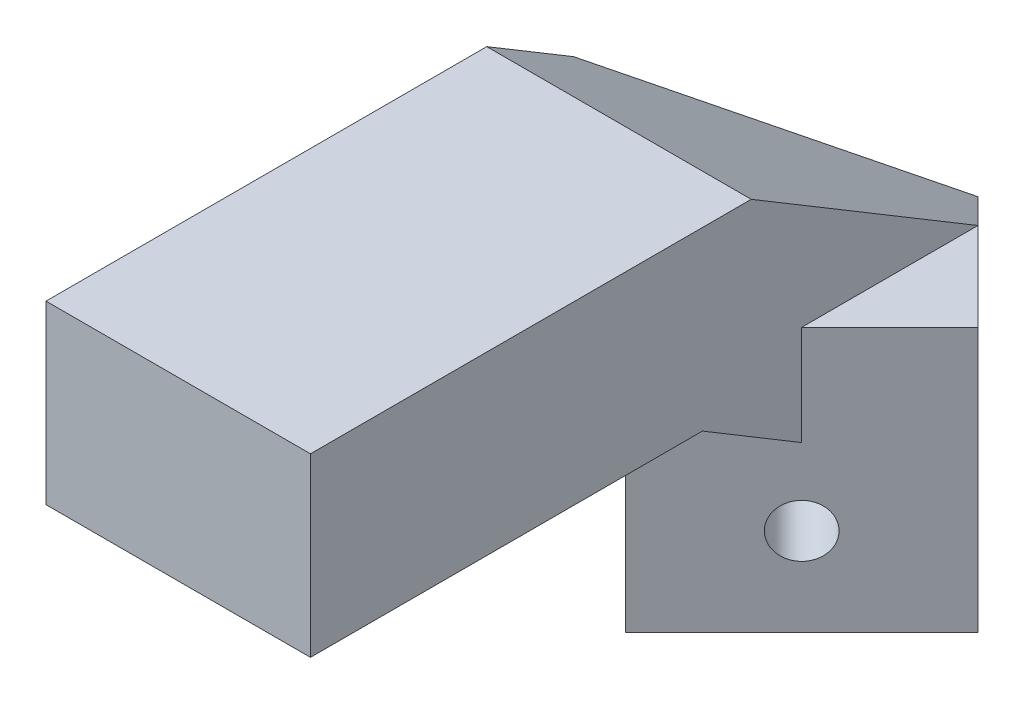
ISO-10303-21;
HEADER;
FILE_DESCRIPTION(('STEP AP214'),'2;1');
FILE_NAME('part.step','',(''),(''),'','','');
FILE_SCHEMA(('AUTOMOTIVE_DESIGN { 1 0 10303 214 1 1 1 1 }'));
ENDSEC;
DATA;
#1=APPLICATION_CONTEXT('core data for automotive mechanical design processes');
#2=APPLICATION_PROTOCOL_DEFINITION('international standard','automotive_design',2000,#1);
#3=PRODUCT_CONTEXT('',#1,'mechanical');
#4=PRODUCT('Part','Part','',(#3));
#5=PRODUCT_RELATED_PRODUCT_CATEGORY('part','',(#4));
#6=PRODUCT_DEFINITION_FORMATION('','',#4);
#7=PRODUCT_DEFINITION_CONTEXT('part definition',#1,'design');
#8=PRODUCT_DEFINITION('design','',#6,#7);
#9=PRODUCT_DEFINITION_SHAPE('','',#8);
#10=(LENGTH_UNIT() NAMED_UNIT(*) SI_UNIT(.MILLI.,.METRE.));
#11=(NAMED_UNIT(*) PLANE_ANGLE_UNIT() SI_UNIT($,.RADIAN.));
#12=(NAMED_UNIT(*) SI_UNIT($,.STERADIAN.) SOLID_ANGLE_UNIT());
#13=UNCERTAINTY_MEASURE_WITH_UNIT(LENGTH_MEASURE(1.E-05),#10,'distance_accuracy_value','');
#14=(GEOMETRIC_REPRESENTATION_CONTEXT(3) GLOBAL_UNCERTAINTY_ASSIGNED_CONTEXT((#13)) GLOBAL_UNIT_ASSIGNED_CONTEXT((#10,
#11,#12)) REPRESENTATION_CONTEXT('',''));
#15=CARTESIAN_POINT('',(0.,0.,0.));
#16=DIRECTION('',(0.,0.,1.));
#17=DIRECTION('',(1.,0.,0.));
#18=AXIS2_PLACEMENT_3D('',#15,#16,#17);
#19=CARTESIAN_POINT('',(30.,-20.,-10.));
#20=DIRECTION('',(0.,0.,-1.));
#21=DIRECTION('',(1.,0.,0.));
#22=AXIS2_PLACEMENT_3D('',#19,#20,#21);
#23=PLANE('',#22);
#24=DIRECTION('',(0.,1.,0.));
#25=VECTOR('',#24,1.);
#26=CARTESIAN_POINT('',(0.,-20.,-10.));
#27=LINE('',#26,#25);
#28=CARTESIAN_POINT('',(0.,-20.,-10.));
#29=VERTEX_POINT('',#28);
#30=CARTESIAN_POINT('',(0.,0.,-10.));
#31=VERTEX_POINT('',#30);
#32=EDGE_CURVE('E182',#29,#31,#27,.T.);
#33=ORIENTED_EDGE('',*,*,#32,.F.);
#34=DIRECTION('',(-1.,0.,0.));
#35=VECTOR('',#34,1.);
#36=CARTESIAN_POINT('',(30.,-20.,-10.));
#37=LINE('',#36,#35);
#38=CARTESIAN_POINT('',(30.,-20.,-10.));
#39=VERTEX_POINT('',#38);
#40=EDGE_CURVE('E196',#39,#29,#37,.T.);
#41=ORIENTED_EDGE('',*,*,#40,.F.);
#42=DIRECTION('',(0.,1.,0.));
#43=VECTOR('',#42,1.);
#44=CARTESIAN_POINT('',(30.,-20.,-10.));
#45=LINE('',#44,#43);
#46=CARTESIAN_POINT('',(30.,0.,-10.));
#47=VERTEX_POINT('',#46);
#48=EDGE_CURVE('E183',#39,#47,#45,.T.);
#49=ORIENTED_EDGE('',*,*,#48,.T.);
#50=DIRECTION('',(-1.,0.,0.));
#51=VECTOR('',#50,1.);
#52=CARTESIAN_POINT('',(30.,0.,-10.));
#53=LINE('',#52,#51);
#54=EDGE_CURVE('E214',#47,#31,#53,.T.);
#55=ORIENTED_EDGE('',*,*,#54,.T.);
#56=EDGE_LOOP('',(#33,#41,#49,#55));
#57=FACE_BOUND('',#56,.T.);
#58=ADVANCED_FACE('F32',(#57),#23,.F.);
#59=CARTESIAN_POINT('',(30.,0.,-10.));
#60=DIRECTION('',(0.,-1.,0.));
#61=DIRECTION('',(0.,0.,1.));
#62=AXIS2_PLACEMENT_3D('',#59,#60,#61);
#63=PLANE('',#62);
#64=DIRECTION('',(0.,0.,-1.));
#65=VECTOR('',#64,1.);
#66=CARTESIAN_POINT('',(0.,0.,-10.));
#67=LINE('',#66,#65);
#68=CARTESIAN_POINT('',(0.,0.,-60.));
#69=VERTEX_POINT('',#68);
#70=EDGE_CURVE('E199',#31,#69,#67,.T.);
#71=ORIENTED_EDGE('',*,*,#70,.F.);
#72=ORIENTED_EDGE('',*,*,#54,.F.);
#73=DIRECTION('',(0.,0.,-1.));
#74=VECTOR('',#73,1.);
#75=CARTESIAN_POINT('',(30.,0.,-10.));
#76=LINE('',#75,#74);
#77=CARTESIAN_POINT('',(30.,0.,-60.));
#78=VERTEX_POINT('',#77);
#79=EDGE_CURVE('E186',#47,#78,#76,.T.);
#80=ORIENTED_EDGE('',*,*,#79,.T.);
#81=DIRECTION('',(-1.,0.,0.));
#82=VECTOR('',#81,1.);
#83=CARTESIAN_POINT('',(30.,0.,-60.));
#84=LINE('',#83,#82);
#85=EDGE_CURVE('E211',#78,#69,#84,.T.);
#86=ORIENTED_EDGE('',*,*,#85,.T.);
#87=EDGE_LOOP('',(#71,#72,#80,#86));
#88=FACE_BOUND('',#87,.T.);
#89=ADVANCED_FACE('F231',(#88),#63,.F.);
#90=CARTESIAN_POINT('',(30.,0.,-60.));
#91=DIRECTION('',(0.,-0.857492925712545,0.514495755427526));
#92=DIRECTION('',(0.,0.514495755427526,0.857492925712545));
#93=AXIS2_PLACEMENT_3D('',#90,#91,#92);
#94=PLANE('',#93);
#95=ORIENTED_EDGE('',*,*,#85,.F.);
#96=DIRECTION('',(0.,-0.514495755427526,-0.857492925712544));
#97=VECTOR('',#96,1.);
#98=CARTESIAN_POINT('',(30.,0.,-60.));
#99=LINE('',#98,#97);
#100=CARTESIAN_POINT('',(30.,-15.4348726628258,-85.7247877713763));
#101=VERTEX_POINT('',#100);
#102=EDGE_CURVE('E133',#78,#101,#99,.T.);
#103=ORIENTED_EDGE('',*,*,#102,.T.);
#104=DIRECTION('',(0.650944554904121,0.390566732942471,0.650944554904118));
#105=VECTOR('',#104,1.);
#106=CARTESIAN_POINT('',(30.8474576271187,-14.9263980865546,-84.8773301442577));
#107=LINE('',#106,#105);
#108=CARTESIAN_POINT('',(22.9289321881345,-19.6775133499451,-92.7958555832418));
#109=VERTEX_POINT('',#108);
#110=EDGE_CURVE('E118',#109,#101,#107,.T.);
#111=ORIENTED_EDGE('',*,*,#110,.F.);
#112=DIRECTION('',(0.650944554904118,-0.390566732942472,-0.650944554904121));
#113=VECTOR('',#112,1.);
#114=CARTESIAN_POINT('',(-26.8724643293838,10.203324560566,-42.9944590657233));
#115=LINE('',#114,#113);
#116=CARTESIAN_POINT('',(0.,-5.92015403706431,-69.8669233951072));
#117=VERTEX_POINT('',#116);
#118=EDGE_CURVE('E11',#117,#109,#115,.T.);
#119=ORIENTED_EDGE('',*,*,#118,.F.);
#120=DIRECTION('',(0.,0.514495755427526,0.857492925712544));
#121=VECTOR('',#120,1.);
#122=CARTESIAN_POINT('',(0.,22.0588235294118,-23.235294117647));
#123=LINE('',#122,#121);
#124=EDGE_CURVE('E134',#117,#69,#123,.T.);
#125=ORIENTED_EDGE('',*,*,#124,.T.);
#126=EDGE_LOOP('',(#95,#103,#111,#119,#125));
#127=FACE_BOUND('',#126,.T.);
#128=ADVANCED_FACE('F132',(#127),#94,.F.);
#129=CARTESIAN_POINT('',(30.,-45.4348726628258,-85.7247877713763));
#130=DIRECTION('',(0.,1.,0.));
#131=DIRECTION('',(0.,0.,-1.));
#132=AXIS2_PLACEMENT_3D('',#129,#130,#131);
#133=PLANE('',#132);
#134=DIRECTION('',(-0.707106781186549,0.,-0.707106781186546));
#135=VECTOR('',#134,1.);
#136=CARTESIAN_POINT('',(40.,-45.4348726628258,-75.7247877713764));
#137=LINE('',#136,#135);
#138=CARTESIAN_POINT('',(40.,-45.4348726628258,-75.7247877713764));
#139=VERTEX_POINT('',#138);
#140=CARTESIAN_POINT('',(22.9289321881345,-45.4348726628258,-92.7958555832418));
#141=VERTEX_POINT('',#140);
#142=EDGE_CURVE('E121',#139,#141,#137,.T.);
#143=ORIENTED_EDGE('',*,*,#142,.F.);
#144=DIRECTION('',(0.707106781186546,0.,-0.707106781186549));
#145=VECTOR('',#144,1.);
#146=CARTESIAN_POINT('',(20.0000000000001,-45.4348726628258,-55.7247877713764));
#147=LINE('',#146,#145);
#148=CARTESIAN_POINT('',(20.0000000000001,-45.4348726628258,-55.7247877713764));
#149=VERTEX_POINT('',#148);
#150=EDGE_CURVE('E153',#149,#139,#147,.T.);
#151=ORIENTED_EDGE('',*,*,#150,.F.);
#152=DIRECTION('',(-0.707106781186549,0.,-0.707106781186546));
#153=VECTOR('',#152,1.);
#154=CARTESIAN_POINT('',(20.0000000000001,-45.4348726628258,-55.7247877713764));
#155=LINE('',#154,#153);
#156=CARTESIAN_POINT('',(2.9289321881346,-45.4348726628258,-72.7958555832418));
#157=VERTEX_POINT('',#156);
#158=EDGE_CURVE('E161',#149,#157,#155,.T.);
#159=ORIENTED_EDGE('',*,*,#158,.T.);
#160=DIRECTION('',(0.707106781186546,0.,-0.707106781186549));
#161=VECTOR('',#160,1.);
#162=CARTESIAN_POINT('',(2.9289321881346,-45.4348726628258,-72.7958555832418));
#163=LINE('',#162,#161);
#164=EDGE_CURVE('E125',#157,#141,#163,.T.);
#165=ORIENTED_EDGE('',*,*,#164,.T.);
#166=EDGE_LOOP('',(#143,#151,#159,#165));
#167=FACE_BOUND('',#166,.T.);
#168=ADVANCED_FACE('F249',(#167),#133,.F.);
#169=CARTESIAN_POINT('',(30.,-20.,-54.4603207010313));
#170=DIRECTION('',(0.,0.857492925712544,-0.514495755427526));
#171=DIRECTION('',(0.,-0.514495755427526,-0.857492925712545));
#172=AXIS2_PLACEMENT_3D('',#169,#170,#171);
#173=PLANE('',#172);
#174=DIRECTION('',(-0.650944554904118,0.390566732942472,0.650944554904121));
#175=VECTOR('',#174,1.);
#176=CARTESIAN_POINT('',(23.5086121967503,-22.8638475602572,-59.2333999681267));
#177=LINE('',#176,#175);
#178=CARTESIAN_POINT('',(30.,-26.758680242207,-65.7247877713763));
#179=VERTEX_POINT('',#178);
#180=CARTESIAN_POINT('',(20.0000000000001,-20.758680242207,-55.7247877713764));
#181=VERTEX_POINT('',#180);
#182=EDGE_CURVE('E170',#179,#181,#177,.T.);
#183=ORIENTED_EDGE('',*,*,#182,.F.);
#184=DIRECTION('',(0.,0.514495755427526,0.857492925712544));
#185=VECTOR('',#184,1.);
#186=CARTESIAN_POINT('',(30.,-20.,-54.4603207010313));
#187=LINE('',#186,#185);
#188=CARTESIAN_POINT('',(30.,-20.,-54.4603207010313));
#189=VERTEX_POINT('',#188);
#190=EDGE_CURVE('E191',#179,#189,#187,.T.);
#191=ORIENTED_EDGE('',*,*,#190,.T.);
#192=DIRECTION('',(-1.,0.,0.));
#193=VECTOR('',#192,1.);
#194=CARTESIAN_POINT('',(30.,-20.,-54.4603207010313));
#195=LINE('',#194,#193);
#196=CARTESIAN_POINT('',(0.,-20.,-54.4603207010313));
#197=VERTEX_POINT('',#196);
#198=EDGE_CURVE('E208',#189,#197,#195,.T.);
#199=ORIENTED_EDGE('',*,*,#198,.T.);
#200=DIRECTION('',(0.,0.514495755427526,0.857492925712544));
#201=VECTOR('',#200,1.);
#202=CARTESIAN_POINT('',(0.,-20.,-54.4603207010313));
#203=LINE('',#202,#201);
#204=CARTESIAN_POINT('',(0.,-20.7586802422069,-55.7247877713762));
#205=VERTEX_POINT('',#204);
#206=EDGE_CURVE('E202',#205,#197,#203,.T.);
#207=ORIENTED_EDGE('',*,*,#206,.F.);
#208=DIRECTION('',(-0.650944554904118,0.390566732942472,0.650944554904121));
#209=VECTOR('',#208,1.);
#210=CARTESIAN_POINT('',(11.9831884679368,-27.948593322969,-67.7079762393131));
#211=LINE('',#210,#209);
#212=CARTESIAN_POINT('',(10.0000000000001,-26.758680242207,-65.7247877713763));
#213=VERTEX_POINT('',#212);
#214=EDGE_CURVE('E179',#213,#205,#211,.T.);
#215=ORIENTED_EDGE('',*,*,#214,.F.);
#216=DIRECTION('',(-0.650944554904121,-0.390566732942471,-0.650944554904118));
#217=VECTOR('',#216,1.);
#218=CARTESIAN_POINT('',(24.9659640744362,-17.7791017975454,-50.7588236969403));
#219=LINE('',#218,#217);
#220=EDGE_CURVE('E176',#181,#213,#219,.T.);
#221=ORIENTED_EDGE('',*,*,#220,.F.);
#222=EDGE_LOOP('',(#183,#191,#199,#207,#215,#221));
#223=FACE_BOUND('',#222,.T.);
#224=ADVANCED_FACE('F239',(#223),#173,.F.);
#225=CARTESIAN_POINT('',(30.,-20.,-10.));
#226=DIRECTION('',(0.,1.,0.));
#227=DIRECTION('',(0.,0.,-1.));
#228=AXIS2_PLACEMENT_3D('',#225,#226,#227);
#229=PLANE('',#228);
#230=DIRECTION('',(0.,0.,1.));
#231=VECTOR('',#230,1.);
#232=CARTESIAN_POINT('',(0.,-20.,-10.));
#233=LINE('',#232,#231);
#234=EDGE_CURVE('E187',#197,#29,#233,.T.);
#235=ORIENTED_EDGE('',*,*,#234,.F.);
#236=ORIENTED_EDGE('',*,*,#198,.F.);
#237=DIRECTION('',(0.,0.,1.));
#238=VECTOR('',#237,1.);
#239=CARTESIAN_POINT('',(30.,-20.,-10.));
#240=LINE('',#239,#238);
#241=EDGE_CURVE('E194',#189,#39,#240,.T.);
#242=ORIENTED_EDGE('',*,*,#241,.T.);
#243=ORIENTED_EDGE('',*,*,#40,.T.);
#244=EDGE_LOOP('',(#235,#236,#242,#243));
#245=FACE_BOUND('',#244,.T.);
#246=ADVANCED_FACE('F227',(#245),#229,.F.);
#247=CARTESIAN_POINT('',(30.,0.,-10.));
#248=DIRECTION('',(1.,0.,0.));
#249=DIRECTION('',(0.,0.,1.));
#250=AXIS2_PLACEMENT_3D('',#247,#248,#249);
#251=PLANE('',#250);
#252=DIRECTION('',(0.,0.,-1.));
#253=VECTOR('',#252,1.);
#254=CARTESIAN_POINT('',(30.,-15.4348726628258,-10.));
#255=LINE('',#254,#253);
#256=CARTESIAN_POINT('',(30.,-15.4348726628258,-65.7247877713763));
#257=VERTEX_POINT('',#256);
#258=EDGE_CURVE('E173',#257,#101,#255,.T.);
#259=ORIENTED_EDGE('',*,*,#258,.T.);
#260=ORIENTED_EDGE('',*,*,#102,.F.);
#261=ORIENTED_EDGE('',*,*,#79,.F.);
#262=ORIENTED_EDGE('',*,*,#48,.F.);
#263=ORIENTED_EDGE('',*,*,#241,.F.);
#264=ORIENTED_EDGE('',*,*,#190,.F.);
#265=DIRECTION('',(0.,1.,0.));
#266=VECTOR('',#265,1.);
#267=CARTESIAN_POINT('',(30.,0.,-65.7247877713763));
#268=LINE('',#267,#266);
#269=EDGE_CURVE('E164',#179,#257,#268,.T.);
#270=ORIENTED_EDGE('',*,*,#269,.T.);
#271=EDGE_LOOP('',(#259,#260,#261,#262,#263,#264,#270));
#272=FACE_BOUND('',#271,.T.);
#273=ADVANCED_FACE('F230',(#272),#251,.T.);
#274=CARTESIAN_POINT('',(0.,0.,-10.));
#275=DIRECTION('',(1.,0.,0.));
#276=DIRECTION('',(0.,0.,1.));
#277=AXIS2_PLACEMENT_3D('',#274,#275,#276);
#278=PLANE('',#277);
#279=DIRECTION('',(0.,1.,0.));
#280=VECTOR('',#279,1.);
#281=CARTESIAN_POINT('',(0.,0.,-69.8669233951072));
#282=LINE('',#281,#280);
#283=CARTESIAN_POINT('',(0.,-25.0013209293262,-69.8669233951072));
#284=VERTEX_POINT('',#283);
#285=EDGE_CURVE('E39',#284,#117,#282,.T.);
#286=ORIENTED_EDGE('',*,*,#285,.F.);
#287=DIRECTION('',(0.,0.287347885566346,0.957826285221151));
#288=VECTOR('',#287,1.);
#289=CARTESIAN_POINT('',(0.,-22.7048456950139,-62.2120059473996));
#290=LINE('',#289,#288);
#291=EDGE_CURVE('E144',#284,#205,#290,.T.);
#292=ORIENTED_EDGE('',*,*,#291,.T.);
#293=ORIENTED_EDGE('',*,*,#206,.T.);
#294=ORIENTED_EDGE('',*,*,#234,.T.);
#295=ORIENTED_EDGE('',*,*,#32,.T.);
#296=ORIENTED_EDGE('',*,*,#70,.T.);
#297=ORIENTED_EDGE('',*,*,#124,.F.);
#298=EDGE_LOOP('',(#286,#292,#293,#294,#295,#296,#297));
#299=FACE_BOUND('',#298,.T.);
#300=ADVANCED_FACE('F223',(#299),#278,.F.);
#301=CARTESIAN_POINT('',(20.0000000000001,-45.4348726628258,-55.7247877713764));
#302=DIRECTION('',(-0.707106781186546,0.,0.707106781186549));
#303=DIRECTION('',(-0.707106781186549,0.,-0.707106781186546));
#304=AXIS2_PLACEMENT_3D('',#301,#302,#303);
#305=PLANE('',#304);
#306=ORIENTED_EDGE('',*,*,#220,.T.);
#307=DIRECTION('',(0.707106781186549,0.,0.707106781186546));
#308=VECTOR('',#307,1.);
#309=CARTESIAN_POINT('',(2.9289321881346,-26.758680242207,-72.7958555832418));
#310=LINE('',#309,#308);
#311=CARTESIAN_POINT('',(2.9289321881346,-26.758680242207,-72.7958555832418));
#312=VERTEX_POINT('',#311);
#313=EDGE_CURVE('E124',#312,#213,#310,.T.);
#314=ORIENTED_EDGE('',*,*,#313,.F.);
#315=DIRECTION('',(0.,-1.,0.));
#316=VECTOR('',#315,1.);
#317=CARTESIAN_POINT('',(2.9289321881346,-26.758680242207,-72.7958555832418));
#318=LINE('',#317,#316);
#319=EDGE_CURVE('E147',#312,#157,#318,.T.);
#320=ORIENTED_EDGE('',*,*,#319,.T.);
#321=ORIENTED_EDGE('',*,*,#158,.F.);
#322=DIRECTION('',(0.,-1.,0.));
#323=VECTOR('',#322,1.);
#324=CARTESIAN_POINT('',(20.0000000000001,-45.4348726628258,-55.7247877713764));
#325=LINE('',#324,#323);
#326=EDGE_CURVE('E151',#181,#149,#325,.T.);
#327=ORIENTED_EDGE('',*,*,#326,.F.);
#328=EDGE_LOOP('',(#306,#314,#320,#321,#327));
#329=FACE_BOUND('',#328,.T.);
#330=ADVANCED_FACE('F251',(#329),#305,.T.);
#331=CARTESIAN_POINT('',(-12.8623938856881,0.,-22.862393885688));
#332=DIRECTION('',(0.707106781186549,0.,0.707106781186546));
#333=DIRECTION('',(-0.707106781186546,0.,0.707106781186549));
#334=AXIS2_PLACEMENT_3D('',#331,#332,#333);
#335=PLANE('',#334);
#336=CARTESIAN_POINT('',(30.,-35.4348726628258,-65.7247877713764));
#337=DIRECTION('',(-0.707106781186549,0.,-0.707106781186546));
#338=DIRECTION('',(-0.707106781186546,0.,0.707106781186549));
#339=AXIS2_PLACEMENT_3D('',#336,#337,#338);
#340=CIRCLE('',#339,3.00000000000001);
#341=CARTESIAN_POINT('',(27.8786796564404,-35.4348726628258,-63.6034674278167));
#342=VERTEX_POINT('',#341);
#343=EDGE_CURVE('E141',#342,#342,#340,.T.);
#344=ORIENTED_EDGE('',*,*,#343,.T.);
#345=EDGE_LOOP('',(#344));
#346=FACE_BOUND('',#345,.T.);
#347=ORIENTED_EDGE('',*,*,#182,.T.);
#348=ORIENTED_EDGE('',*,*,#326,.T.);
#349=ORIENTED_EDGE('',*,*,#150,.T.);
#350=DIRECTION('',(0.,1.,0.));
#351=VECTOR('',#350,1.);
#352=CARTESIAN_POINT('',(40.,-45.4348726628258,-75.7247877713764));
#353=LINE('',#352,#351);
#354=CARTESIAN_POINT('',(40.,-15.4348726628258,-75.7247877713764));
#355=VERTEX_POINT('',#354);
#356=EDGE_CURVE('E156',#139,#355,#353,.T.);
#357=ORIENTED_EDGE('',*,*,#356,.T.);
#358=DIRECTION('',(-0.707106781186546,0.,0.707106781186549));
#359=VECTOR('',#358,1.);
#360=CARTESIAN_POINT('',(20.0000000000001,-15.4348726628258,-55.7247877713764));
#361=LINE('',#360,#359);
#362=EDGE_CURVE('E159',#355,#257,#361,.T.);
#363=ORIENTED_EDGE('',*,*,#362,.T.);
#364=ORIENTED_EDGE('',*,*,#269,.F.);
#365=EDGE_LOOP('',(#347,#348,#349,#357,#363,#364));
#366=FACE_BOUND('',#365,.T.);
#367=ADVANCED_FACE('F246',(#346,#366),#335,.T.);
#368=CARTESIAN_POINT('',(20.0000000000001,-15.4348726628258,-55.7247877713764));
#369=DIRECTION('',(0.,1.,0.));
#370=DIRECTION('',(0.,0.,-1.));
#371=AXIS2_PLACEMENT_3D('',#368,#369,#370);
#372=PLANE('',#371);
#373=ORIENTED_EDGE('',*,*,#362,.F.);
#374=DIRECTION('',(-0.707106781186549,0.,-0.707106781186546));
#375=VECTOR('',#374,1.);
#376=CARTESIAN_POINT('',(40.,-15.4348726628258,-75.7247877713764));
#377=LINE('',#376,#375);
#378=EDGE_CURVE('E162',#355,#101,#377,.T.);
#379=ORIENTED_EDGE('',*,*,#378,.T.);
#380=ORIENTED_EDGE('',*,*,#258,.F.);
#381=EDGE_LOOP('',(#373,#379,#380));
#382=FACE_BOUND('',#381,.T.);
#383=ADVANCED_FACE('F244',(#382),#372,.T.);
#384=CARTESIAN_POINT('',(40.,-45.4348726628258,-75.7247877713764));
#385=DIRECTION('',(0.707106781186546,0.,-0.707106781186549));
#386=DIRECTION('',(0.707106781186549,0.,0.707106781186546));
#387=AXIS2_PLACEMENT_3D('',#384,#385,#386);
#388=PLANE('',#387);
#389=ORIENTED_EDGE('',*,*,#110,.T.);
#390=ORIENTED_EDGE('',*,*,#378,.F.);
#391=ORIENTED_EDGE('',*,*,#356,.F.);
#392=ORIENTED_EDGE('',*,*,#142,.T.);
#393=DIRECTION('',(0.,1.,0.));
#394=VECTOR('',#393,1.);
#395=CARTESIAN_POINT('',(22.9289321881345,-45.4348726628258,-92.7958555832418));
#396=LINE('',#395,#394);
#397=EDGE_CURVE('E115',#141,#109,#396,.T.);
#398=ORIENTED_EDGE('',*,*,#397,.T.);
#399=EDGE_LOOP('',(#389,#390,#391,#392,#398));
#400=FACE_BOUND('',#399,.T.);
#401=ADVANCED_FACE('F116',(#400),#388,.T.);
#402=CARTESIAN_POINT('',(-7.07106781186549,-20.7586802422069,-62.7958555832417));
#403=DIRECTION('',(0.276172385369497,0.920574617898323,-0.276172385369498));
#404=DIRECTION('',(0.,-0.287347885566346,-0.957826285221151));
#405=AXIS2_PLACEMENT_3D('',#402,#403,#404);
#406=PLANE('',#405);
#407=DIRECTION('',(0.650944554904118,-0.390566732942472,-0.65094455490412));
#408=VECTOR('',#407,1.);
#409=CARTESIAN_POINT('',(-7.07106781186549,-20.7586802422069,-62.7958555832417));
#410=LINE('',#409,#408);
#411=EDGE_CURVE('E49',#284,#312,#410,.T.);
#412=ORIENTED_EDGE('',*,*,#411,.T.);
#413=ORIENTED_EDGE('',*,*,#313,.T.);
#414=ORIENTED_EDGE('',*,*,#214,.T.);
#415=ORIENTED_EDGE('',*,*,#291,.F.);
#416=EDGE_LOOP('',(#412,#413,#414,#415));
#417=FACE_BOUND('',#416,.T.);
#418=ADVANCED_FACE('F234',(#417),#406,.F.);
#419=CARTESIAN_POINT('',(-29.9334616975536,0.,-39.9334616975535));
#420=DIRECTION('',(-0.707106781186549,0.,-0.707106781186546));
#421=DIRECTION('',(0.707106781186546,0.,-0.707106781186549));
#422=AXIS2_PLACEMENT_3D('',#419,#420,#421);
#423=PLANE('',#422);
#424=ORIENTED_EDGE('',*,*,#118,.T.);
#425=ORIENTED_EDGE('',*,*,#397,.F.);
#426=ORIENTED_EDGE('',*,*,#164,.F.);
#427=ORIENTED_EDGE('',*,*,#319,.F.);
#428=ORIENTED_EDGE('',*,*,#411,.F.);
#429=ORIENTED_EDGE('',*,*,#285,.T.);
#430=EDGE_LOOP('',(#424,#425,#426,#427,#428,#429));
#431=FACE_BOUND('',#430,.T.);
#432=CARTESIAN_POINT('',(12.9289321881345,-35.4348726628258,-82.7958555832418));
#433=DIRECTION('',(0.707106781186549,0.,0.707106781186546));
#434=DIRECTION('',(0.707106781186546,0.,-0.707106781186549));
#435=AXIS2_PLACEMENT_3D('',#432,#433,#434);
#436=CIRCLE('',#435,3.00000000000001);
#437=CARTESIAN_POINT('',(15.0502525316942,-35.4348726628258,-84.9171759268014));
#438=VERTEX_POINT('',#437);
#439=EDGE_CURVE('E136',#438,#438,#436,.T.);
#440=ORIENTED_EDGE('',*,*,#439,.T.);
#441=EDGE_LOOP('',(#440));
#442=FACE_BOUND('',#441,.T.);
#443=ADVANCED_FACE('F128',(#431,#442),#423,.T.);
#444=CARTESIAN_POINT('',(62.8623938856882,-35.4348726628258,-32.8623938856883));
#445=DIRECTION('',(-0.707106781186549,0.,-0.707106781186546));
#446=DIRECTION('',(0.707106781186546,0.,-0.707106781186549));
#447=AXIS2_PLACEMENT_3D('',#444,#445,#446);
#448=CYLINDRICAL_SURFACE('',#447,3.00000000000001);
#449=ORIENTED_EDGE('',*,*,#343,.F.);
#450=EDGE_LOOP('',(#449));
#451=FACE_BOUND('',#450,.T.);
#452=ORIENTED_EDGE('',*,*,#439,.F.);
#453=EDGE_LOOP('',(#452));
#454=FACE_BOUND('',#453,.T.);
#455=ADVANCED_FACE('F331',(#451,#454),#448,.F.);
#456=CLOSED_SHELL('',(#58,#89,#128,#168,#224,#246,#273,#300,#330,#367,#383,#401,#418,#443,#455));
#457=MANIFOLD_SOLID_BREP('B2',#456);
#458=ADVANCED_BREP_SHAPE_REPRESENTATION('',(#18,#457),#14);
#459=SHAPE_DEFINITION_REPRESENTATION(#9,#458);
ENDSEC;
END-ISO-10303-21;
